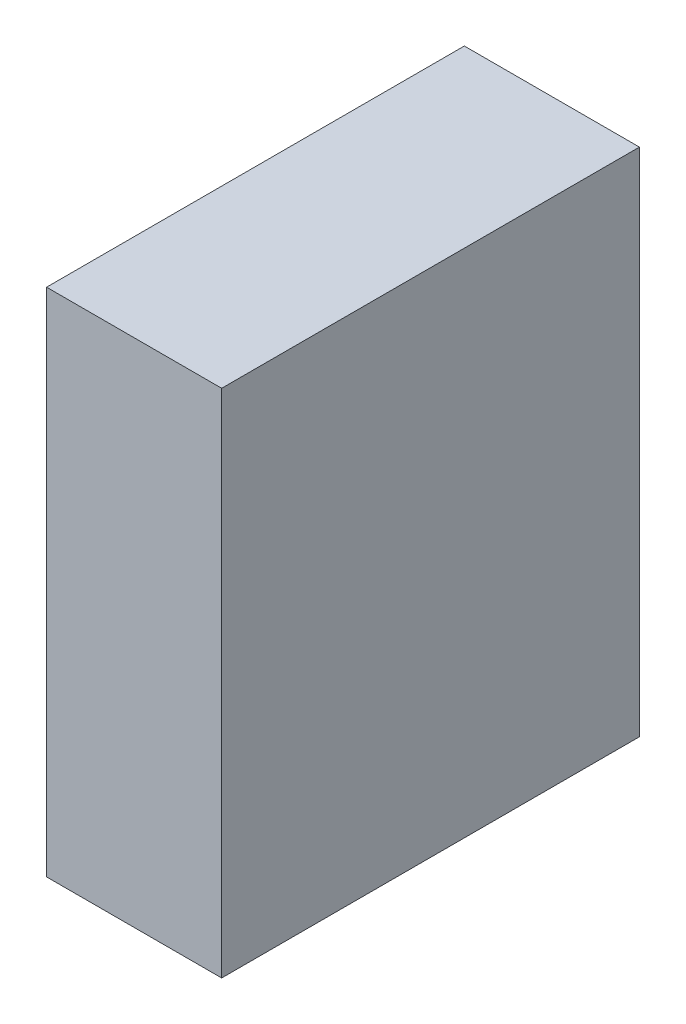
ISO-10303-21;
HEADER;
FILE_DESCRIPTION(('STEP AP214'),'2;1');
FILE_NAME('part.step','',(''),(''),'','','');
FILE_SCHEMA(('AUTOMOTIVE_DESIGN { 1 0 10303 214 1 1 1 1 }'));
ENDSEC;
DATA;
#1=APPLICATION_CONTEXT('core data for automotive mechanical design processes');
#2=APPLICATION_PROTOCOL_DEFINITION('international standard','automotive_design',2000,#1);
#3=PRODUCT_CONTEXT('',#1,'mechanical');
#4=PRODUCT('Part','Part','',(#3));
#5=PRODUCT_RELATED_PRODUCT_CATEGORY('part','',(#4));
#6=PRODUCT_DEFINITION_FORMATION('','',#4);
#7=PRODUCT_DEFINITION_CONTEXT('part definition',#1,'design');
#8=PRODUCT_DEFINITION('design','',#6,#7);
#9=PRODUCT_DEFINITION_SHAPE('','',#8);
#10=(LENGTH_UNIT() NAMED_UNIT(*) SI_UNIT(.MILLI.,.METRE.));
#11=(NAMED_UNIT(*) PLANE_ANGLE_UNIT() SI_UNIT($,.RADIAN.));
#12=(NAMED_UNIT(*) SI_UNIT($,.STERADIAN.) SOLID_ANGLE_UNIT());
#13=UNCERTAINTY_MEASURE_WITH_UNIT(LENGTH_MEASURE(1.E-05),#10,'distance_accuracy_value','');
#14=(GEOMETRIC_REPRESENTATION_CONTEXT(3) GLOBAL_UNCERTAINTY_ASSIGNED_CONTEXT((#13)) GLOBAL_UNIT_ASSIGNED_CONTEXT((#10,
#11,#12)) REPRESENTATION_CONTEXT('',''));
#15=CARTESIAN_POINT('',(0.,0.,0.));
#16=DIRECTION('',(0.,0.,1.));
#17=DIRECTION('',(1.,0.,0.));
#18=AXIS2_PLACEMENT_3D('',#15,#16,#17);
#19=CARTESIAN_POINT('',(1.,6.70212946727133,-47.2309601837537));
#20=DIRECTION('',(0.,0.,-1.));
#21=DIRECTION('',(-1.,0.,0.));
#22=AXIS2_PLACEMENT_3D('',#19,#20,#21);
#23=PLANE('',#22);
#24=DIRECTION('',(0.,-1.,0.));
#25=VECTOR('',#24,1.);
#26=CARTESIAN_POINT('',(0.,6.70212946727133,-47.2309601837537));
#27=LINE('',#26,#25);
#28=CARTESIAN_POINT('',(0.,6.70212946727133,-47.2309601837537));
#29=VERTEX_POINT('',#28);
#30=CARTESIAN_POINT('',(0.,3.78496272634266,-47.2309601837537));
#31=VERTEX_POINT('',#30);
#32=EDGE_CURVE('E96',#29,#31,#27,.T.);
#33=ORIENTED_EDGE('',*,*,#32,.T.);
#34=DIRECTION('',(-1.,0.,0.));
#35=VECTOR('',#34,1.);
#36=CARTESIAN_POINT('',(1.,3.78496272634266,-47.2309601837537));
#37=LINE('',#36,#35);
#38=CARTESIAN_POINT('',(1.,3.78496272634266,-47.2309601837537));
#39=VERTEX_POINT('',#38);
#40=EDGE_CURVE('E11',#39,#31,#37,.T.);
#41=ORIENTED_EDGE('',*,*,#40,.F.);
#42=DIRECTION('',(0.,-1.,0.));
#43=VECTOR('',#42,1.);
#44=CARTESIAN_POINT('',(1.,6.70212946727133,-47.2309601837537));
#45=LINE('',#44,#43);
#46=CARTESIAN_POINT('',(1.,6.70212946727133,-47.2309601837537));
#47=VERTEX_POINT('',#46);
#48=EDGE_CURVE('E84',#47,#39,#45,.T.);
#49=ORIENTED_EDGE('',*,*,#48,.F.);
#50=DIRECTION('',(-1.,0.,0.));
#51=VECTOR('',#50,1.);
#52=CARTESIAN_POINT('',(1.,6.70212946727133,-47.2309601837537));
#53=LINE('',#52,#51);
#54=EDGE_CURVE('E92',#47,#29,#53,.T.);
#55=ORIENTED_EDGE('',*,*,#54,.T.);
#56=EDGE_LOOP('',(#33,#41,#49,#55));
#57=FACE_BOUND('',#56,.T.);
#58=ADVANCED_FACE('F33',(#57),#23,.F.);
#59=CARTESIAN_POINT('',(1.,3.78496272634266,-47.2309601837537));
#60=DIRECTION('',(0.,1.,0.));
#61=DIRECTION('',(0.,0.,1.));
#62=AXIS2_PLACEMENT_3D('',#59,#60,#61);
#63=PLANE('',#62);
#64=DIRECTION('',(0.,0.,-1.));
#65=VECTOR('',#64,1.);
#66=CARTESIAN_POINT('',(0.,3.78496272634266,-47.2309601837537));
#67=LINE('',#66,#65);
#68=CARTESIAN_POINT('',(0.,3.78496272634266,-49.6170506663134));
#69=VERTEX_POINT('',#68);
#70=EDGE_CURVE('E88',#31,#69,#67,.T.);
#71=ORIENTED_EDGE('',*,*,#70,.T.);
#72=DIRECTION('',(-1.,0.,0.));
#73=VECTOR('',#72,1.);
#74=CARTESIAN_POINT('',(1.,3.78496272634266,-49.6170506663134));
#75=LINE('',#74,#73);
#76=CARTESIAN_POINT('',(1.,3.78496272634266,-49.6170506663134));
#77=VERTEX_POINT('',#76);
#78=EDGE_CURVE('E41',#77,#69,#75,.T.);
#79=ORIENTED_EDGE('',*,*,#78,.F.);
#80=DIRECTION('',(0.,0.,-1.));
#81=VECTOR('',#80,1.);
#82=CARTESIAN_POINT('',(1.,3.78496272634266,-47.2309601837537));
#83=LINE('',#82,#81);
#84=EDGE_CURVE('E79',#39,#77,#83,.T.);
#85=ORIENTED_EDGE('',*,*,#84,.F.);
#86=ORIENTED_EDGE('',*,*,#40,.T.);
#87=EDGE_LOOP('',(#71,#79,#85,#86));
#88=FACE_BOUND('',#87,.T.);
#89=ADVANCED_FACE('F87',(#88),#63,.F.);
#90=CARTESIAN_POINT('',(1.,6.70212946727133,-49.6170506663134));
#91=DIRECTION('',(0.,0.,1.));
#92=DIRECTION('',(1.,0.,0.));
#93=AXIS2_PLACEMENT_3D('',#90,#91,#92);
#94=PLANE('',#93);
#95=DIRECTION('',(0.,1.,0.));
#96=VECTOR('',#95,1.);
#97=CARTESIAN_POINT('',(0.,6.70212946727133,-49.6170506663134));
#98=LINE('',#97,#96);
#99=CARTESIAN_POINT('',(0.,6.70212946727133,-49.6170506663134));
#100=VERTEX_POINT('',#99);
#101=EDGE_CURVE('E66',#69,#100,#98,.T.);
#102=ORIENTED_EDGE('',*,*,#101,.T.);
#103=DIRECTION('',(-1.,0.,0.));
#104=VECTOR('',#103,1.);
#105=CARTESIAN_POINT('',(1.,6.70212946727133,-49.6170506663134));
#106=LINE('',#105,#104);
#107=CARTESIAN_POINT('',(1.,6.70212946727133,-49.6170506663134));
#108=VERTEX_POINT('',#107);
#109=EDGE_CURVE('E89',#108,#100,#106,.T.);
#110=ORIENTED_EDGE('',*,*,#109,.F.);
#111=DIRECTION('',(0.,1.,0.));
#112=VECTOR('',#111,1.);
#113=CARTESIAN_POINT('',(1.,6.70212946727133,-49.6170506663134));
#114=LINE('',#113,#112);
#115=EDGE_CURVE('E82',#77,#108,#114,.T.);
#116=ORIENTED_EDGE('',*,*,#115,.F.);
#117=ORIENTED_EDGE('',*,*,#78,.T.);
#118=EDGE_LOOP('',(#102,#110,#116,#117));
#119=FACE_BOUND('',#118,.T.);
#120=ADVANCED_FACE('F90',(#119),#94,.F.);
#121=CARTESIAN_POINT('',(1.,6.70212946727133,-47.2309601837537));
#122=DIRECTION('',(0.,-1.,0.));
#123=DIRECTION('',(0.,0.,-1.));
#124=AXIS2_PLACEMENT_3D('',#121,#122,#123);
#125=PLANE('',#124);
#126=DIRECTION('',(0.,0.,1.));
#127=VECTOR('',#126,1.);
#128=CARTESIAN_POINT('',(0.,6.70212946727133,-47.2309601837537));
#129=LINE('',#128,#127);
#130=EDGE_CURVE('E72',#100,#29,#129,.T.);
#131=ORIENTED_EDGE('',*,*,#130,.T.);
#132=ORIENTED_EDGE('',*,*,#54,.F.);
#133=DIRECTION('',(0.,0.,1.));
#134=VECTOR('',#133,1.);
#135=CARTESIAN_POINT('',(1.,6.70212946727133,-47.2309601837537));
#136=LINE('',#135,#134);
#137=EDGE_CURVE('E49',#108,#47,#136,.T.);
#138=ORIENTED_EDGE('',*,*,#137,.F.);
#139=ORIENTED_EDGE('',*,*,#109,.T.);
#140=EDGE_LOOP('',(#131,#132,#138,#139));
#141=FACE_BOUND('',#140,.T.);
#142=ADVANCED_FACE('F103',(#141),#125,.F.);
#143=CARTESIAN_POINT('',(1.,0.,0.));
#144=DIRECTION('',(1.,0.,0.));
#145=DIRECTION('',(0.,0.,-1.));
#146=AXIS2_PLACEMENT_3D('',#143,#144,#145);
#147=PLANE('',#146);
#148=ORIENTED_EDGE('',*,*,#48,.T.);
#149=ORIENTED_EDGE('',*,*,#84,.T.);
#150=ORIENTED_EDGE('',*,*,#115,.T.);
#151=ORIENTED_EDGE('',*,*,#137,.T.);
#152=EDGE_LOOP('',(#148,#149,#150,#151));
#153=FACE_BOUND('',#152,.T.);
#154=ADVANCED_FACE('F80',(#153),#147,.T.);
#155=CARTESIAN_POINT('',(0.,0.,0.));
#156=DIRECTION('',(1.,0.,0.));
#157=DIRECTION('',(0.,0.,-1.));
#158=AXIS2_PLACEMENT_3D('',#155,#156,#157);
#159=PLANE('',#158);
#160=ORIENTED_EDGE('',*,*,#32,.F.);
#161=ORIENTED_EDGE('',*,*,#130,.F.);
#162=ORIENTED_EDGE('',*,*,#101,.F.);
#163=ORIENTED_EDGE('',*,*,#70,.F.);
#164=EDGE_LOOP('',(#160,#161,#162,#163));
#165=FACE_BOUND('',#164,.T.);
#166=ADVANCED_FACE('F106',(#165),#159,.F.);
#167=CLOSED_SHELL('',(#58,#89,#120,#142,#154,#166));
#168=MANIFOLD_SOLID_BREP('B2',#167);
#169=ADVANCED_BREP_SHAPE_REPRESENTATION('',(#18,#168),#14);
#170=SHAPE_DEFINITION_REPRESENTATION(#9,#169);
ENDSEC;
END-ISO-10303-21;
